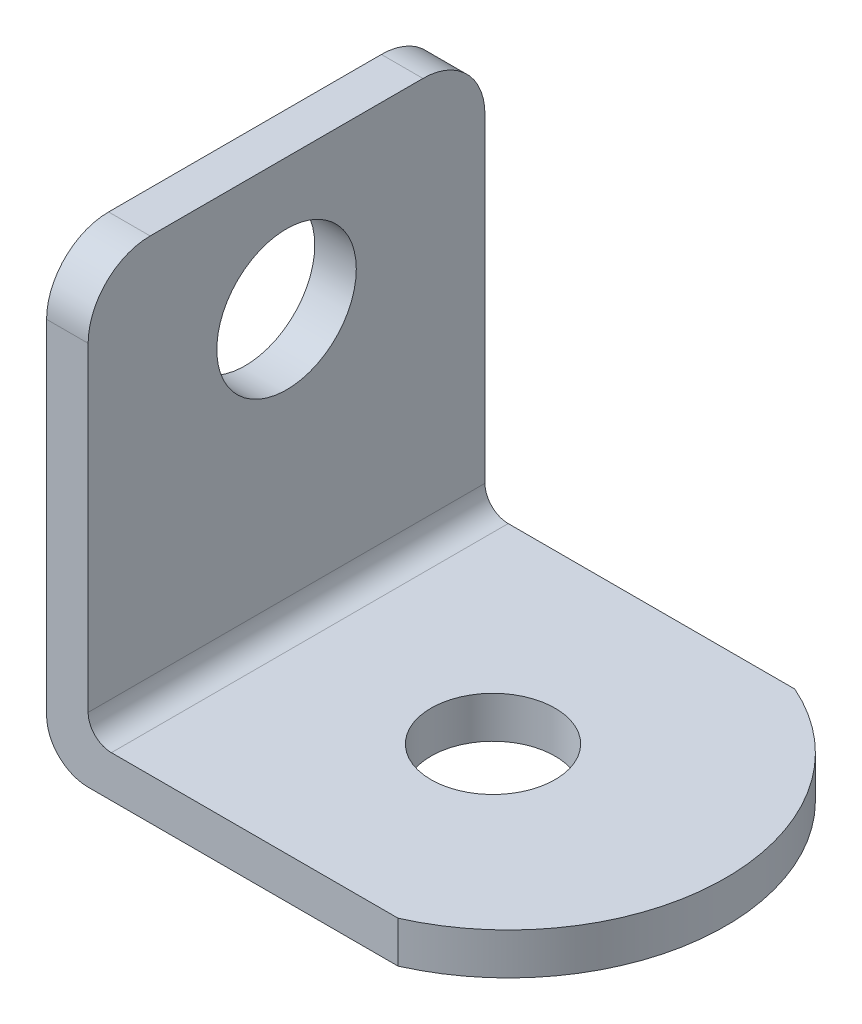
ISO-10303-21;
HEADER;
FILE_DESCRIPTION(('STEP AP214'),'2;1');
FILE_NAME('part.step','',(''),(''),'','','');
FILE_SCHEMA(('AUTOMOTIVE_DESIGN { 1 0 10303 214 1 1 1 1 }'));
ENDSEC;
DATA;
#1=APPLICATION_CONTEXT('core data for automotive mechanical design processes');
#2=APPLICATION_PROTOCOL_DEFINITION('international standard','automotive_design',2000,#1);
#3=PRODUCT_CONTEXT('',#1,'mechanical');
#4=PRODUCT('Part','Part','',(#3));
#5=PRODUCT_RELATED_PRODUCT_CATEGORY('part','',(#4));
#6=PRODUCT_DEFINITION_FORMATION('','',#4);
#7=PRODUCT_DEFINITION_CONTEXT('part definition',#1,'design');
#8=PRODUCT_DEFINITION('design','',#6,#7);
#9=PRODUCT_DEFINITION_SHAPE('','',#8);
#10=(LENGTH_UNIT() NAMED_UNIT(*) SI_UNIT(.MILLI.,.METRE.));
#11=(NAMED_UNIT(*) PLANE_ANGLE_UNIT() SI_UNIT($,.RADIAN.));
#12=(NAMED_UNIT(*) SI_UNIT($,.STERADIAN.) SOLID_ANGLE_UNIT());
#13=UNCERTAINTY_MEASURE_WITH_UNIT(LENGTH_MEASURE(1.E-05),#10,'distance_accuracy_value','');
#14=(GEOMETRIC_REPRESENTATION_CONTEXT(3) GLOBAL_UNCERTAINTY_ASSIGNED_CONTEXT((#13)) GLOBAL_UNIT_ASSIGNED_CONTEXT((#10,
#11,#12)) REPRESENTATION_CONTEXT('',''));
#15=CARTESIAN_POINT('',(0.,0.,0.));
#16=DIRECTION('',(0.,0.,1.));
#17=DIRECTION('',(1.,0.,0.));
#18=AXIS2_PLACEMENT_3D('',#15,#16,#17);
#19=CARTESIAN_POINT('',(1.34,0.,0.));
#20=DIRECTION('',(-1.,0.,0.));
#21=DIRECTION('',(0.,0.,1.));
#22=AXIS2_PLACEMENT_3D('',#19,#20,#21);
#23=PLANE('',#22);
#24=CARTESIAN_POINT('',(1.34,10.15,0.));
#25=DIRECTION('',(1.,0.,0.));
#26=DIRECTION('',(0.,0.,-1.));
#27=AXIS2_PLACEMENT_3D('',#24,#25,#26);
#28=CIRCLE('',#27,2.25);
#29=CARTESIAN_POINT('',(1.34,10.15,-2.25));
#30=VERTEX_POINT('',#29);
#31=EDGE_CURVE('E157',#30,#30,#28,.T.);
#32=ORIENTED_EDGE('',*,*,#31,.F.);
#33=EDGE_LOOP('',(#32));
#34=FACE_BOUND('',#33,.T.);
#35=DIRECTION('',(0.,1.,0.));
#36=VECTOR('',#35,1.);
#37=CARTESIAN_POINT('',(1.34,0.,6.4));
#38=LINE('',#37,#36);
#39=CARTESIAN_POINT('',(1.34,2.09,6.4));
#40=VERTEX_POINT('',#39);
#41=CARTESIAN_POINT('',(1.34,12.4,6.4));
#42=VERTEX_POINT('',#41);
#43=EDGE_CURVE('E163',#40,#42,#38,.T.);
#44=ORIENTED_EDGE('',*,*,#43,.F.);
#45=DIRECTION('',(0.,0.,1.));
#46=VECTOR('',#45,1.);
#47=CARTESIAN_POINT('',(1.34,2.09,-6.4));
#48=LINE('',#47,#46);
#49=CARTESIAN_POINT('',(1.34,2.09,-6.4));
#50=VERTEX_POINT('',#49);
#51=EDGE_CURVE('E201',#40,#50,#48,.F.);
#52=ORIENTED_EDGE('',*,*,#51,.T.);
#53=DIRECTION('',(0.,1.,0.));
#54=VECTOR('',#53,1.);
#55=CARTESIAN_POINT('',(1.34,0.,-6.4));
#56=LINE('',#55,#54);
#57=CARTESIAN_POINT('',(1.34,12.4,-6.4));
#58=VERTEX_POINT('',#57);
#59=EDGE_CURVE('E169',#50,#58,#56,.T.);
#60=ORIENTED_EDGE('',*,*,#59,.T.);
#61=CARTESIAN_POINT('',(1.34,12.4,-4.4));
#62=DIRECTION('',(-1.,0.,0.));
#63=DIRECTION('',(0.,0.,1.));
#64=AXIS2_PLACEMENT_3D('',#61,#62,#63);
#65=CIRCLE('',#64,2.);
#66=CARTESIAN_POINT('',(1.34,14.4,-4.4));
#67=VERTEX_POINT('',#66);
#68=EDGE_CURVE('E195',#58,#67,#65,.F.);
#69=ORIENTED_EDGE('',*,*,#68,.T.);
#70=DIRECTION('',(0.,0.,-1.));
#71=VECTOR('',#70,1.);
#72=CARTESIAN_POINT('',(1.34,14.4,6.4));
#73=LINE('',#72,#71);
#74=CARTESIAN_POINT('',(1.34,14.4,4.4));
#75=VERTEX_POINT('',#74);
#76=EDGE_CURVE('E165',#75,#67,#73,.T.);
#77=ORIENTED_EDGE('',*,*,#76,.F.);
#78=CARTESIAN_POINT('',(1.34,12.4,4.4));
#79=DIRECTION('',(-1.,0.,0.));
#80=DIRECTION('',(0.,0.,1.));
#81=AXIS2_PLACEMENT_3D('',#78,#79,#80);
#82=CIRCLE('',#81,2.);
#83=EDGE_CURVE('E192',#75,#42,#82,.F.);
#84=ORIENTED_EDGE('',*,*,#83,.T.);
#85=EDGE_LOOP('',(#44,#52,#60,#69,#77,#84));
#86=FACE_BOUND('',#85,.T.);
#87=ADVANCED_FACE('F48',(#34,#86),#23,.F.);
#88=CARTESIAN_POINT('',(0.,0.,0.));
#89=DIRECTION('',(-1.,0.,0.));
#90=DIRECTION('',(0.,0.,1.));
#91=AXIS2_PLACEMENT_3D('',#88,#89,#90);
#92=PLANE('',#91);
#93=DIRECTION('',(0.,1.,0.));
#94=VECTOR('',#93,1.);
#95=CARTESIAN_POINT('',(0.,0.,-6.4));
#96=LINE('',#95,#94);
#97=CARTESIAN_POINT('',(0.,1.34,-6.4));
#98=VERTEX_POINT('',#97);
#99=CARTESIAN_POINT('',(0.,12.4,-6.4));
#100=VERTEX_POINT('',#99);
#101=EDGE_CURVE('E166',#98,#100,#96,.T.);
#102=ORIENTED_EDGE('',*,*,#101,.F.);
#103=DIRECTION('',(0.,0.,-1.));
#104=VECTOR('',#103,1.);
#105=CARTESIAN_POINT('',(0.,1.34,6.4));
#106=LINE('',#105,#104);
#107=CARTESIAN_POINT('',(0.,1.34,6.4));
#108=VERTEX_POINT('',#107);
#109=EDGE_CURVE('E56',#98,#108,#106,.F.);
#110=ORIENTED_EDGE('',*,*,#109,.T.);
#111=DIRECTION('',(0.,1.,0.));
#112=VECTOR('',#111,1.);
#113=CARTESIAN_POINT('',(0.,0.,6.4));
#114=LINE('',#113,#112);
#115=CARTESIAN_POINT('',(0.,12.4,6.4));
#116=VERTEX_POINT('',#115);
#117=EDGE_CURVE('E160',#108,#116,#114,.T.);
#118=ORIENTED_EDGE('',*,*,#117,.T.);
#119=CARTESIAN_POINT('',(0.,12.4,4.4));
#120=DIRECTION('',(-1.,0.,0.));
#121=DIRECTION('',(0.,0.,1.));
#122=AXIS2_PLACEMENT_3D('',#119,#120,#121);
#123=CIRCLE('',#122,2.);
#124=CARTESIAN_POINT('',(0.,14.4,4.4));
#125=VERTEX_POINT('',#124);
#126=EDGE_CURVE('E184',#116,#125,#123,.T.);
#127=ORIENTED_EDGE('',*,*,#126,.T.);
#128=DIRECTION('',(0.,0.,-1.));
#129=VECTOR('',#128,1.);
#130=CARTESIAN_POINT('',(0.,14.4,6.4));
#131=LINE('',#130,#129);
#132=CARTESIAN_POINT('',(0.,14.4,-4.4));
#133=VERTEX_POINT('',#132);
#134=EDGE_CURVE('E173',#125,#133,#131,.T.);
#135=ORIENTED_EDGE('',*,*,#134,.T.);
#136=CARTESIAN_POINT('',(0.,12.4,-4.4));
#137=DIRECTION('',(-1.,0.,0.));
#138=DIRECTION('',(0.,0.,1.));
#139=AXIS2_PLACEMENT_3D('',#136,#137,#138);
#140=CIRCLE('',#139,2.);
#141=EDGE_CURVE('E186',#133,#100,#140,.T.);
#142=ORIENTED_EDGE('',*,*,#141,.T.);
#143=EDGE_LOOP('',(#102,#110,#118,#127,#135,#142));
#144=FACE_BOUND('',#143,.T.);
#145=CARTESIAN_POINT('',(0.,10.15,0.));
#146=DIRECTION('',(1.,0.,0.));
#147=DIRECTION('',(0.,0.,-1.));
#148=AXIS2_PLACEMENT_3D('',#145,#146,#147);
#149=CIRCLE('',#148,2.25);
#150=CARTESIAN_POINT('',(0.,10.15,-2.25));
#151=VERTEX_POINT('',#150);
#152=EDGE_CURVE('E143',#151,#151,#149,.T.);
#153=ORIENTED_EDGE('',*,*,#152,.T.);
#154=EDGE_LOOP('',(#153));
#155=FACE_BOUND('',#154,.T.);
#156=ADVANCED_FACE('F236',(#144,#155),#92,.T.);
#157=CARTESIAN_POINT('',(1.34,0.,6.4));
#158=DIRECTION('',(0.,0.,1.));
#159=DIRECTION('',(1.,0.,0.));
#160=AXIS2_PLACEMENT_3D('',#157,#158,#159);
#161=PLANE('',#160);
#162=ORIENTED_EDGE('',*,*,#117,.F.);
#163=CARTESIAN_POINT('',(1.34,1.34,6.4));
#164=DIRECTION('',(0.,0.,1.));
#165=DIRECTION('',(1.,0.,0.));
#166=AXIS2_PLACEMENT_3D('',#163,#164,#165);
#167=CIRCLE('',#166,1.34);
#168=CARTESIAN_POINT('',(1.34,0.,6.4));
#169=VERTEX_POINT('',#168);
#170=EDGE_CURVE('E12',#108,#169,#167,.T.);
#171=ORIENTED_EDGE('',*,*,#170,.T.);
#172=DIRECTION('',(-1.,0.,0.));
#173=VECTOR('',#172,1.);
#174=CARTESIAN_POINT('',(1.34,0.,6.4));
#175=LINE('',#174,#173);
#176=CARTESIAN_POINT('',(11.3354893757516,0.,6.4));
#177=VERTEX_POINT('',#176);
#178=EDGE_CURVE('E139',#177,#169,#175,.T.);
#179=ORIENTED_EDGE('',*,*,#178,.F.);
#180=DIRECTION('',(0.,-1.,0.));
#181=VECTOR('',#180,1.);
#182=CARTESIAN_POINT('',(11.3354893757516,1.34,6.4));
#183=LINE('',#182,#181);
#184=CARTESIAN_POINT('',(11.3354893757516,1.34,6.4));
#185=VERTEX_POINT('',#184);
#186=EDGE_CURVE('E136',#185,#177,#183,.T.);
#187=ORIENTED_EDGE('',*,*,#186,.F.);
#188=DIRECTION('',(1.,0.,0.));
#189=VECTOR('',#188,1.);
#190=CARTESIAN_POINT('',(0.,1.34,6.4));
#191=LINE('',#190,#189);
#192=CARTESIAN_POINT('',(2.09,1.34,6.4));
#193=VERTEX_POINT('',#192);
#194=EDGE_CURVE('E123',#193,#185,#191,.T.);
#195=ORIENTED_EDGE('',*,*,#194,.F.);
#196=CARTESIAN_POINT('',(2.09,2.09,6.4));
#197=DIRECTION('',(0.,0.,1.));
#198=DIRECTION('',(1.,0.,0.));
#199=AXIS2_PLACEMENT_3D('',#196,#197,#198);
#200=CIRCLE('',#199,0.75);
#201=EDGE_CURVE('E203',#193,#40,#200,.F.);
#202=ORIENTED_EDGE('',*,*,#201,.T.);
#203=ORIENTED_EDGE('',*,*,#43,.T.);
#204=DIRECTION('',(-1.,0.,0.));
#205=VECTOR('',#204,1.);
#206=CARTESIAN_POINT('',(1.34,12.4,6.4));
#207=LINE('',#206,#205);
#208=EDGE_CURVE('E197',#42,#116,#207,.T.);
#209=ORIENTED_EDGE('',*,*,#208,.T.);
#210=EDGE_LOOP('',(#162,#171,#179,#187,#195,#202,#203,#209));
#211=FACE_BOUND('',#210,.T.);
#212=ADVANCED_FACE('F137',(#211),#161,.T.);
#213=CARTESIAN_POINT('',(1.34,0.,6.4));
#214=DIRECTION('',(0.,1.,0.));
#215=DIRECTION('',(0.,0.,1.));
#216=AXIS2_PLACEMENT_3D('',#213,#214,#215);
#217=PLANE('',#216);
#218=ORIENTED_EDGE('',*,*,#178,.T.);
#219=DIRECTION('',(0.,0.,-1.));
#220=VECTOR('',#219,1.);
#221=CARTESIAN_POINT('',(1.34,0.,-6.4));
#222=LINE('',#221,#220);
#223=CARTESIAN_POINT('',(1.34,0.,-6.4));
#224=VERTEX_POINT('',#223);
#225=EDGE_CURVE('E207',#169,#224,#222,.T.);
#226=ORIENTED_EDGE('',*,*,#225,.T.);
#227=DIRECTION('',(-1.,0.,0.));
#228=VECTOR('',#227,1.);
#229=CARTESIAN_POINT('',(1.34,0.,-6.4));
#230=LINE('',#229,#228);
#231=CARTESIAN_POINT('',(11.3354893757516,0.,-6.4));
#232=VERTEX_POINT('',#231);
#233=EDGE_CURVE('E171',#232,#224,#230,.T.);
#234=ORIENTED_EDGE('',*,*,#233,.F.);
#235=CARTESIAN_POINT('',(8.5,0.,0.));
#236=DIRECTION('',(0.,1.,0.));
#237=DIRECTION('',(0.,0.,-1.));
#238=AXIS2_PLACEMENT_3D('',#235,#236,#237);
#239=CIRCLE('',#238,7.);
#240=EDGE_CURVE('E133',#177,#232,#239,.T.);
#241=ORIENTED_EDGE('',*,*,#240,.F.);
#242=EDGE_LOOP('',(#218,#226,#234,#241));
#243=FACE_BOUND('',#242,.T.);
#244=CARTESIAN_POINT('',(8.,0.,0.));
#245=DIRECTION('',(0.,1.,0.));
#246=DIRECTION('',(0.,0.,1.));
#247=AXIS2_PLACEMENT_3D('',#244,#245,#246);
#248=CIRCLE('',#247,2.);
#249=CARTESIAN_POINT('',(8.,0.,2.));
#250=VERTEX_POINT('',#249);
#251=EDGE_CURVE('E354',#250,#250,#248,.T.);
#252=ORIENTED_EDGE('',*,*,#251,.T.);
#253=EDGE_LOOP('',(#252));
#254=FACE_BOUND('',#253,.T.);
#255=ADVANCED_FACE('F212',(#243,#254),#217,.F.);
#256=CARTESIAN_POINT('',(1.34,0.,-6.4));
#257=DIRECTION('',(0.,0.,1.));
#258=DIRECTION('',(0.,-1.,0.));
#259=AXIS2_PLACEMENT_3D('',#256,#257,#258);
#260=PLANE('',#259);
#261=ORIENTED_EDGE('',*,*,#233,.T.);
#262=CARTESIAN_POINT('',(1.34,1.34,-6.4));
#263=DIRECTION('',(0.,0.,1.));
#264=DIRECTION('',(0.,-1.,0.));
#265=AXIS2_PLACEMENT_3D('',#262,#263,#264);
#266=CIRCLE('',#265,1.34);
#267=EDGE_CURVE('E70',#224,#98,#266,.F.);
#268=ORIENTED_EDGE('',*,*,#267,.T.);
#269=ORIENTED_EDGE('',*,*,#101,.T.);
#270=DIRECTION('',(-1.,0.,0.));
#271=VECTOR('',#270,1.);
#272=CARTESIAN_POINT('',(1.34,12.4,-6.4));
#273=LINE('',#272,#271);
#274=EDGE_CURVE('E189',#100,#58,#273,.F.);
#275=ORIENTED_EDGE('',*,*,#274,.T.);
#276=ORIENTED_EDGE('',*,*,#59,.F.);
#277=CARTESIAN_POINT('',(2.09,2.09,-6.4));
#278=DIRECTION('',(0.,0.,1.));
#279=DIRECTION('',(0.,-1.,0.));
#280=AXIS2_PLACEMENT_3D('',#277,#278,#279);
#281=CIRCLE('',#280,0.75);
#282=CARTESIAN_POINT('',(2.09,1.34,-6.4));
#283=VERTEX_POINT('',#282);
#284=EDGE_CURVE('E205',#50,#283,#281,.T.);
#285=ORIENTED_EDGE('',*,*,#284,.T.);
#286=DIRECTION('',(-1.,0.,0.));
#287=VECTOR('',#286,1.);
#288=CARTESIAN_POINT('',(0.,1.34,-6.4));
#289=LINE('',#288,#287);
#290=CARTESIAN_POINT('',(11.3354893757516,1.34,-6.4));
#291=VERTEX_POINT('',#290);
#292=EDGE_CURVE('E149',#291,#283,#289,.T.);
#293=ORIENTED_EDGE('',*,*,#292,.F.);
#294=DIRECTION('',(0.,-1.,0.));
#295=VECTOR('',#294,1.);
#296=CARTESIAN_POINT('',(11.3354893757516,1.34,-6.4));
#297=LINE('',#296,#295);
#298=EDGE_CURVE('E144',#291,#232,#297,.T.);
#299=ORIENTED_EDGE('',*,*,#298,.T.);
#300=EDGE_LOOP('',(#261,#268,#269,#275,#276,#285,#293,#299));
#301=FACE_BOUND('',#300,.T.);
#302=ADVANCED_FACE('F216',(#301),#260,.F.);
#303=CARTESIAN_POINT('',(1.34,14.4,6.4));
#304=DIRECTION('',(0.,1.,0.));
#305=DIRECTION('',(0.,0.,1.));
#306=AXIS2_PLACEMENT_3D('',#303,#304,#305);
#307=PLANE('',#306);
#308=ORIENTED_EDGE('',*,*,#76,.T.);
#309=DIRECTION('',(-1.,0.,0.));
#310=VECTOR('',#309,1.);
#311=CARTESIAN_POINT('',(0.,14.4,-4.4));
#312=LINE('',#311,#310);
#313=EDGE_CURVE('E181',#67,#133,#312,.T.);
#314=ORIENTED_EDGE('',*,*,#313,.T.);
#315=ORIENTED_EDGE('',*,*,#134,.F.);
#316=DIRECTION('',(-1.,0.,0.));
#317=VECTOR('',#316,1.);
#318=CARTESIAN_POINT('',(1.34,14.4,4.4));
#319=LINE('',#318,#317);
#320=EDGE_CURVE('E178',#125,#75,#319,.F.);
#321=ORIENTED_EDGE('',*,*,#320,.T.);
#322=EDGE_LOOP('',(#308,#314,#315,#321));
#323=FACE_BOUND('',#322,.T.);
#324=ADVANCED_FACE('F252',(#323),#307,.T.);
#325=CARTESIAN_POINT('',(1.34,10.15,0.));
#326=DIRECTION('',(-1.,0.,0.));
#327=DIRECTION('',(0.,0.,1.));
#328=AXIS2_PLACEMENT_3D('',#325,#326,#327);
#329=CYLINDRICAL_SURFACE('',#328,2.25);
#330=ORIENTED_EDGE('',*,*,#31,.T.);
#331=EDGE_LOOP('',(#330));
#332=FACE_BOUND('',#331,.T.);
#333=ORIENTED_EDGE('',*,*,#152,.F.);
#334=EDGE_LOOP('',(#333));
#335=FACE_BOUND('',#334,.T.);
#336=ADVANCED_FACE('F245',(#332,#335),#329,.F.);
#337=CARTESIAN_POINT('',(8.5,1.34,0.));
#338=DIRECTION('',(0.,-1.,0.));
#339=DIRECTION('',(0.,0.,-1.));
#340=AXIS2_PLACEMENT_3D('',#337,#338,#339);
#341=PLANE('',#340);
#342=CARTESIAN_POINT('',(8.,1.34,0.));
#343=DIRECTION('',(0.,1.,0.));
#344=DIRECTION('',(0.,0.,1.));
#345=AXIS2_PLACEMENT_3D('',#342,#343,#344);
#346=CIRCLE('',#345,2.);
#347=CARTESIAN_POINT('',(8.,1.34,2.));
#348=VERTEX_POINT('',#347);
#349=EDGE_CURVE('E155',#348,#348,#346,.T.);
#350=ORIENTED_EDGE('',*,*,#349,.F.);
#351=EDGE_LOOP('',(#350));
#352=FACE_BOUND('',#351,.T.);
#353=ORIENTED_EDGE('',*,*,#292,.T.);
#354=DIRECTION('',(0.,0.,1.));
#355=VECTOR('',#354,1.);
#356=CARTESIAN_POINT('',(2.09,1.34,6.4));
#357=LINE('',#356,#355);
#358=EDGE_CURVE('E131',#283,#193,#357,.T.);
#359=ORIENTED_EDGE('',*,*,#358,.T.);
#360=ORIENTED_EDGE('',*,*,#194,.T.);
#361=CARTESIAN_POINT('',(8.5,1.34,0.));
#362=DIRECTION('',(0.,1.,0.));
#363=DIRECTION('',(0.,0.,-1.));
#364=AXIS2_PLACEMENT_3D('',#361,#362,#363);
#365=CIRCLE('',#364,7.);
#366=EDGE_CURVE('E128',#185,#291,#365,.T.);
#367=ORIENTED_EDGE('',*,*,#366,.T.);
#368=EDGE_LOOP('',(#353,#359,#360,#367));
#369=FACE_BOUND('',#368,.T.);
#370=ADVANCED_FACE('F126',(#352,#369),#341,.F.);
#371=CARTESIAN_POINT('',(8.5,1.34,0.));
#372=DIRECTION('',(0.,-1.,0.));
#373=DIRECTION('',(0.,0.,-1.));
#374=AXIS2_PLACEMENT_3D('',#371,#372,#373);
#375=CYLINDRICAL_SURFACE('',#374,7.);
#376=ORIENTED_EDGE('',*,*,#240,.T.);
#377=ORIENTED_EDGE('',*,*,#298,.F.);
#378=ORIENTED_EDGE('',*,*,#366,.F.);
#379=ORIENTED_EDGE('',*,*,#186,.T.);
#380=EDGE_LOOP('',(#376,#377,#378,#379));
#381=FACE_BOUND('',#380,.T.);
#382=ADVANCED_FACE('F146',(#381),#375,.T.);
#383=CARTESIAN_POINT('',(8.,1.34,0.));
#384=DIRECTION('',(0.,-1.,0.));
#385=DIRECTION('',(0.,0.,-1.));
#386=AXIS2_PLACEMENT_3D('',#383,#384,#385);
#387=CYLINDRICAL_SURFACE('',#386,2.);
#388=ORIENTED_EDGE('',*,*,#349,.T.);
#389=EDGE_LOOP('',(#388));
#390=FACE_BOUND('',#389,.T.);
#391=ORIENTED_EDGE('',*,*,#251,.F.);
#392=EDGE_LOOP('',(#391));
#393=FACE_BOUND('',#392,.T.);
#394=ADVANCED_FACE('F261',(#390,#393),#387,.F.);
#395=CARTESIAN_POINT('',(1.34,12.4,-4.4));
#396=DIRECTION('',(1.,0.,0.));
#397=DIRECTION('',(0.,0.,-1.));
#398=AXIS2_PLACEMENT_3D('',#395,#396,#397);
#399=CYLINDRICAL_SURFACE('',#398,2.);
#400=ORIENTED_EDGE('',*,*,#68,.F.);
#401=ORIENTED_EDGE('',*,*,#274,.F.);
#402=ORIENTED_EDGE('',*,*,#141,.F.);
#403=ORIENTED_EDGE('',*,*,#313,.F.);
#404=EDGE_LOOP('',(#400,#401,#402,#403));
#405=FACE_BOUND('',#404,.T.);
#406=ADVANCED_FACE('F258',(#405),#399,.T.);
#407=CARTESIAN_POINT('',(1.34,12.4,4.4));
#408=DIRECTION('',(-1.,0.,0.));
#409=DIRECTION('',(0.,0.,1.));
#410=AXIS2_PLACEMENT_3D('',#407,#408,#409);
#411=CYLINDRICAL_SURFACE('',#410,2.);
#412=ORIENTED_EDGE('',*,*,#83,.F.);
#413=ORIENTED_EDGE('',*,*,#320,.F.);
#414=ORIENTED_EDGE('',*,*,#126,.F.);
#415=ORIENTED_EDGE('',*,*,#208,.F.);
#416=EDGE_LOOP('',(#412,#413,#414,#415));
#417=FACE_BOUND('',#416,.T.);
#418=ADVANCED_FACE('F230',(#417),#411,.T.);
#419=CARTESIAN_POINT('',(2.09,2.09,0.));
#420=DIRECTION('',(0.,0.,-1.));
#421=DIRECTION('',(-1.,0.,0.));
#422=AXIS2_PLACEMENT_3D('',#419,#420,#421);
#423=CYLINDRICAL_SURFACE('',#422,0.75);
#424=ORIENTED_EDGE('',*,*,#284,.F.);
#425=ORIENTED_EDGE('',*,*,#51,.F.);
#426=ORIENTED_EDGE('',*,*,#201,.F.);
#427=ORIENTED_EDGE('',*,*,#358,.F.);
#428=EDGE_LOOP('',(#424,#425,#426,#427));
#429=FACE_BOUND('',#428,.T.);
#430=ADVANCED_FACE('F220',(#429),#423,.F.);
#431=CARTESIAN_POINT('',(1.34,1.34,6.4));
#432=DIRECTION('',(0.,0.,1.));
#433=DIRECTION('',(1.,0.,0.));
#434=AXIS2_PLACEMENT_3D('',#431,#432,#433);
#435=CYLINDRICAL_SURFACE('',#434,1.34);
#436=ORIENTED_EDGE('',*,*,#170,.F.);
#437=ORIENTED_EDGE('',*,*,#109,.F.);
#438=ORIENTED_EDGE('',*,*,#267,.F.);
#439=ORIENTED_EDGE('',*,*,#225,.F.);
#440=EDGE_LOOP('',(#436,#437,#438,#439));
#441=FACE_BOUND('',#440,.T.);
#442=ADVANCED_FACE('F50',(#441),#435,.T.);
#443=CLOSED_SHELL('',(#87,#156,#212,#255,#302,#324,#336,#370,#382,#394,#406,#418,#430,#442));
#444=MANIFOLD_SOLID_BREP('B2',#443);
#445=ADVANCED_BREP_SHAPE_REPRESENTATION('',(#18,#444),#14);
#446=SHAPE_DEFINITION_REPRESENTATION(#9,#445);
ENDSEC;
END-ISO-10303-21;
